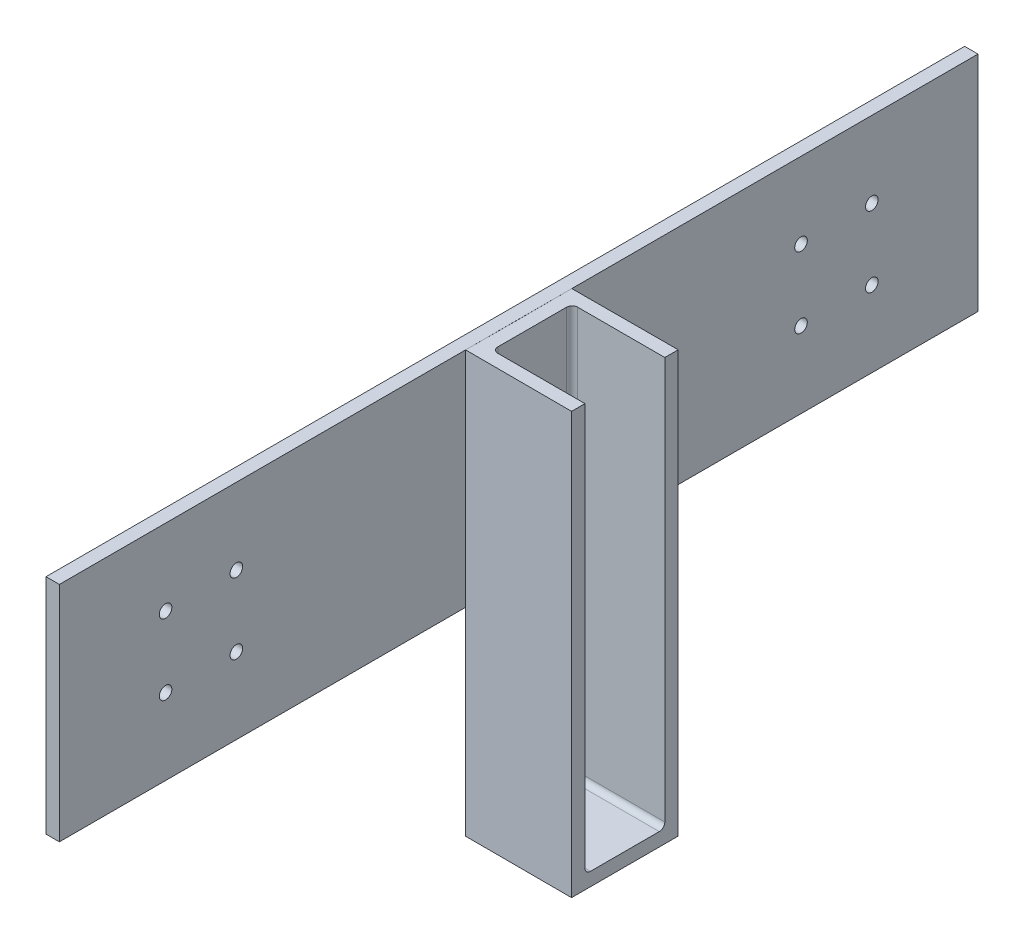
ISO-10303-21;
HEADER;
FILE_DESCRIPTION(('STEP AP214'),'2;1');
FILE_NAME('part.step','',(''),(''),'','','');
FILE_SCHEMA(('AUTOMOTIVE_DESIGN { 1 0 10303 214 1 1 1 1 }'));
ENDSEC;
DATA;
#1=APPLICATION_CONTEXT('core data for automotive mechanical design processes');
#2=APPLICATION_PROTOCOL_DEFINITION('international standard','automotive_design',2000,#1);
#3=PRODUCT_CONTEXT('',#1,'mechanical');
#4=PRODUCT('Part','Part','',(#3));
#5=PRODUCT_RELATED_PRODUCT_CATEGORY('part','',(#4));
#6=PRODUCT_DEFINITION_FORMATION('','',#4);
#7=PRODUCT_DEFINITION_CONTEXT('part definition',#1,'design');
#8=PRODUCT_DEFINITION('design','',#6,#7);
#9=PRODUCT_DEFINITION_SHAPE('','',#8);
#10=(LENGTH_UNIT() NAMED_UNIT(*) SI_UNIT(.MILLI.,.METRE.));
#11=(NAMED_UNIT(*) PLANE_ANGLE_UNIT() SI_UNIT($,.RADIAN.));
#12=(NAMED_UNIT(*) SI_UNIT($,.STERADIAN.) SOLID_ANGLE_UNIT());
#13=UNCERTAINTY_MEASURE_WITH_UNIT(LENGTH_MEASURE(1.E-05),#10,'distance_accuracy_value','');
#14=(GEOMETRIC_REPRESENTATION_CONTEXT(3) GLOBAL_UNCERTAINTY_ASSIGNED_CONTEXT((#13)) GLOBAL_UNIT_ASSIGNED_CONTEXT((#10,
#11,#12)) REPRESENTATION_CONTEXT('',''));
#15=CARTESIAN_POINT('',(0.,0.,0.));
#16=DIRECTION('',(0.,0.,1.));
#17=DIRECTION('',(1.,0.,0.));
#18=AXIS2_PLACEMENT_3D('',#15,#16,#17);
#19=CARTESIAN_POINT('',(21.45,-47.5614084507042,-53.5877812618552));
#20=DIRECTION('',(0.,0.,1.));
#21=DIRECTION('',(1.,0.,0.));
#22=AXIS2_PLACEMENT_3D('',#19,#20,#21);
#23=PLANE('',#22);
#24=DIRECTION('',(0.,1.,0.));
#25=VECTOR('',#24,1.);
#26=CARTESIAN_POINT('',(5.82012302529325,-45.1614084507042,-53.5877812618552));
#27=LINE('',#26,#25);
#28=CARTESIAN_POINT('',(5.82012302529325,27.9985915492958,-53.5877812618552));
#29=VERTEX_POINT('',#28);
#30=CARTESIAN_POINT('',(5.82012302529325,-44.1614084507042,-53.5877812618552));
#31=VERTEX_POINT('',#30);
#32=EDGE_CURVE('E219',#29,#31,#27,.F.);
#33=ORIENTED_EDGE('',*,*,#32,.T.);
#34=DIRECTION('',(1.,0.,0.));
#35=VECTOR('',#34,1.);
#36=CARTESIAN_POINT('',(21.45,-44.1614084507042,-53.5877812618552));
#37=LINE('',#36,#35);
#38=CARTESIAN_POINT('',(21.45,-44.1614084507042,-53.5877812618552));
#39=VERTEX_POINT('',#38);
#40=EDGE_CURVE('E221',#31,#39,#37,.T.);
#41=ORIENTED_EDGE('',*,*,#40,.T.);
#42=DIRECTION('',(0.,1.,0.));
#43=VECTOR('',#42,1.);
#44=CARTESIAN_POINT('',(21.45,-47.5614084507042,-53.5877812618552));
#45=LINE('',#44,#43);
#46=CARTESIAN_POINT('',(21.45,27.9985915492958,-53.5877812618552));
#47=VERTEX_POINT('',#46);
#48=EDGE_CURVE('E203',#39,#47,#45,.T.);
#49=ORIENTED_EDGE('',*,*,#48,.T.);
#50=DIRECTION('',(1.,0.,0.));
#51=VECTOR('',#50,1.);
#52=CARTESIAN_POINT('',(21.45,27.9985915492958,-53.5877812618552));
#53=LINE('',#52,#51);
#54=EDGE_CURVE('E190',#29,#47,#53,.T.);
#55=ORIENTED_EDGE('',*,*,#54,.F.);
#56=EDGE_LOOP('',(#33,#41,#49,#55));
#57=FACE_BOUND('',#56,.T.);
#58=ADVANCED_FACE('F45',(#57),#23,.T.);
#59=CARTESIAN_POINT('',(4.82012302529325,-47.5614084507042,-53.5877812618552));
#60=DIRECTION('',(1.,0.,0.));
#61=DIRECTION('',(0.,0.,-1.));
#62=AXIS2_PLACEMENT_3D('',#59,#60,#61);
#63=PLANE('',#62);
#64=DIRECTION('',(0.,0.,-1.));
#65=VECTOR('',#64,1.);
#66=CARTESIAN_POINT('',(4.82012302529325,-44.1614084507042,-53.5877812618552));
#67=LINE('',#66,#65);
#68=CARTESIAN_POINT('',(4.82012302529325,-44.1614084507042,-40.25728916068));
#69=VERTEX_POINT('',#68);
#70=CARTESIAN_POINT('',(4.82012302529325,-44.1614084507042,-52.5877812618552));
#71=VERTEX_POINT('',#70);
#72=EDGE_CURVE('E62',#69,#71,#67,.T.);
#73=ORIENTED_EDGE('',*,*,#72,.T.);
#74=DIRECTION('',(0.,1.,0.));
#75=VECTOR('',#74,1.);
#76=CARTESIAN_POINT('',(4.82012302529325,27.9985915492958,-52.5877812618552));
#77=LINE('',#76,#75);
#78=CARTESIAN_POINT('',(4.82012302529325,27.9985915492958,-52.5877812618552));
#79=VERTEX_POINT('',#78);
#80=EDGE_CURVE('E225',#71,#79,#77,.T.);
#81=ORIENTED_EDGE('',*,*,#80,.T.);
#82=DIRECTION('',(0.,0.,-1.));
#83=VECTOR('',#82,1.);
#84=CARTESIAN_POINT('',(4.82012302529325,27.9985915492958,-53.5877812618552));
#85=LINE('',#84,#83);
#86=CARTESIAN_POINT('',(4.82012302529325,27.9985915492958,-40.25728916068));
#87=VERTEX_POINT('',#86);
#88=EDGE_CURVE('E187',#87,#79,#85,.T.);
#89=ORIENTED_EDGE('',*,*,#88,.F.);
#90=DIRECTION('',(0.,1.,0.));
#91=VECTOR('',#90,1.);
#92=CARTESIAN_POINT('',(4.82012302529325,-45.1614084507042,-40.25728916068));
#93=LINE('',#92,#91);
#94=EDGE_CURVE('E67',#87,#69,#93,.F.);
#95=ORIENTED_EDGE('',*,*,#94,.T.);
#96=EDGE_LOOP('',(#73,#81,#89,#95));
#97=FACE_BOUND('',#96,.T.);
#98=ADVANCED_FACE('F287',(#97),#63,.T.);
#99=CARTESIAN_POINT('',(21.45,-47.5614084507042,-39.25728916068));
#100=DIRECTION('',(0.,0.,-1.));
#101=DIRECTION('',(-1.,0.,0.));
#102=AXIS2_PLACEMENT_3D('',#99,#100,#101);
#103=PLANE('',#102);
#104=DIRECTION('',(0.,1.,0.));
#105=VECTOR('',#104,1.);
#106=CARTESIAN_POINT('',(21.45,-47.5614084507042,-39.25728916068));
#107=LINE('',#106,#105);
#108=CARTESIAN_POINT('',(21.45,-44.1614084507042,-39.25728916068));
#109=VERTEX_POINT('',#108);
#110=CARTESIAN_POINT('',(21.45,27.9985915492958,-39.25728916068));
#111=VERTEX_POINT('',#110);
#112=EDGE_CURVE('E206',#109,#111,#107,.T.);
#113=ORIENTED_EDGE('',*,*,#112,.F.);
#114=DIRECTION('',(-1.,0.,0.));
#115=VECTOR('',#114,1.);
#116=CARTESIAN_POINT('',(21.45,-44.1614084507042,-39.25728916068));
#117=LINE('',#116,#115);
#118=CARTESIAN_POINT('',(5.82012302529325,-44.1614084507042,-39.25728916068));
#119=VERTEX_POINT('',#118);
#120=EDGE_CURVE('E210',#109,#119,#117,.T.);
#121=ORIENTED_EDGE('',*,*,#120,.T.);
#122=DIRECTION('',(0.,1.,0.));
#123=VECTOR('',#122,1.);
#124=CARTESIAN_POINT('',(5.82012302529325,27.9985915492958,-39.25728916068));
#125=LINE('',#124,#123);
#126=CARTESIAN_POINT('',(5.82012302529325,27.9985915492958,-39.25728916068));
#127=VERTEX_POINT('',#126);
#128=EDGE_CURVE('E198',#119,#127,#125,.T.);
#129=ORIENTED_EDGE('',*,*,#128,.T.);
#130=DIRECTION('',(-1.,0.,0.));
#131=VECTOR('',#130,1.);
#132=CARTESIAN_POINT('',(21.45,27.9985915492958,-39.25728916068));
#133=LINE('',#132,#131);
#134=EDGE_CURVE('E184',#111,#127,#133,.T.);
#135=ORIENTED_EDGE('',*,*,#134,.F.);
#136=EDGE_LOOP('',(#113,#121,#129,#135));
#137=FACE_BOUND('',#136,.T.);
#138=ADVANCED_FACE('F266',(#137),#103,.T.);
#139=CARTESIAN_POINT('',(2.42012302529325,-47.5614084507042,-46.4225352112676));
#140=DIRECTION('',(-0.999997768354908,0.,-0.00211264885940152));
#141=DIRECTION('',(-0.00211264885940152,0.,0.999997768354908));
#142=AXIS2_PLACEMENT_3D('',#139,#140,#141);
#143=PLANE('',#142);
#144=DIRECTION('',(-0.00211264885940152,0.,0.999997768354908));
#145=VECTOR('',#144,1.);
#146=CARTESIAN_POINT('',(2.42012302529325,27.9985915492958,-46.4225352112676));
#147=LINE('',#146,#145);
#148=CARTESIAN_POINT('',(2.42012302529325,27.9985915492958,-46.4225352112676));
#149=VERTEX_POINT('',#148);
#150=CARTESIAN_POINT('',(2.4,27.9985915492958,-36.8975352112676));
#151=VERTEX_POINT('',#150);
#152=EDGE_CURVE('E178',#149,#151,#147,.T.);
#153=ORIENTED_EDGE('',*,*,#152,.F.);
#154=DIRECTION('',(0.,1.,0.));
#155=VECTOR('',#154,1.);
#156=CARTESIAN_POINT('',(2.42012302529325,-47.5614084507042,-46.4225352112676));
#157=LINE('',#156,#155);
#158=CARTESIAN_POINT('',(2.42012302529325,-47.5614084507042,-46.4225352112676));
#159=VERTEX_POINT('',#158);
#160=EDGE_CURVE('E164',#159,#149,#157,.T.);
#161=ORIENTED_EDGE('',*,*,#160,.F.);
#162=DIRECTION('',(-0.00211264885940152,0.,0.999997768354908));
#163=VECTOR('',#162,1.);
#164=CARTESIAN_POINT('',(2.42012302529325,-47.5614084507042,-46.4225352112676));
#165=LINE('',#164,#163);
#166=CARTESIAN_POINT('',(2.4,-47.5614084507042,-36.8975352112676));
#167=VERTEX_POINT('',#166);
#168=EDGE_CURVE('E158',#159,#167,#165,.T.);
#169=ORIENTED_EDGE('',*,*,#168,.T.);
#170=DIRECTION('',(0.,1.,0.));
#171=VECTOR('',#170,1.);
#172=CARTESIAN_POINT('',(2.4,-47.5614084507042,-36.8975352112676));
#173=LINE('',#172,#171);
#174=EDGE_CURVE('E140',#167,#151,#173,.T.);
#175=ORIENTED_EDGE('',*,*,#174,.T.);
#176=EDGE_LOOP('',(#153,#161,#169,#175));
#177=FACE_BOUND('',#176,.T.);
#178=ADVANCED_FACE('F163',(#177),#143,.T.);
#179=CARTESIAN_POINT('',(2.42012302529325,-47.5614084507042,-46.4225352112676));
#180=DIRECTION('',(-0.999997768354908,0.,0.00211264885940152));
#181=DIRECTION('',(0.00211264885940152,0.,0.999997768354908));
#182=AXIS2_PLACEMENT_3D('',#179,#180,#181);
#183=PLANE('',#182);
#184=DIRECTION('',(0.00211264885940152,0.,0.999997768354908));
#185=VECTOR('',#184,1.);
#186=CARTESIAN_POINT('',(2.42012302529325,27.9985915492958,-46.4225352112676));
#187=LINE('',#186,#185);
#188=CARTESIAN_POINT('',(2.4,27.9985915492958,-55.9475352112676));
#189=VERTEX_POINT('',#188);
#190=EDGE_CURVE('E165',#189,#149,#187,.T.);
#191=ORIENTED_EDGE('',*,*,#190,.F.);
#192=DIRECTION('',(0.,1.,0.));
#193=VECTOR('',#192,1.);
#194=CARTESIAN_POINT('',(2.4,-47.5614084507042,-55.9475352112676));
#195=LINE('',#194,#193);
#196=CARTESIAN_POINT('',(2.4,-47.5614084507042,-55.9475352112676));
#197=VERTEX_POINT('',#196);
#198=EDGE_CURVE('E199',#197,#189,#195,.T.);
#199=ORIENTED_EDGE('',*,*,#198,.F.);
#200=DIRECTION('',(0.00211264885940152,0.,0.999997768354908));
#201=VECTOR('',#200,1.);
#202=CARTESIAN_POINT('',(2.42012302529325,-47.5614084507042,-46.4225352112676));
#203=LINE('',#202,#201);
#204=EDGE_CURVE('E151',#197,#159,#203,.T.);
#205=ORIENTED_EDGE('',*,*,#204,.T.);
#206=ORIENTED_EDGE('',*,*,#160,.T.);
#207=EDGE_LOOP('',(#191,#199,#205,#206));
#208=FACE_BOUND('',#207,.T.);
#209=ADVANCED_FACE('F275',(#208),#183,.T.);
#210=CARTESIAN_POINT('',(2.4,-47.5614084507042,-55.9475352112676));
#211=DIRECTION('',(-0.00211264885945948,0.,-0.999997768354908));
#212=DIRECTION('',(-0.999997768354908,0.,0.00211264885945948));
#213=AXIS2_PLACEMENT_3D('',#210,#211,#212);
#214=PLANE('',#213);
#215=DIRECTION('',(-0.999997768354908,0.,0.00211264885945948));
#216=VECTOR('',#215,1.);
#217=CARTESIAN_POINT('',(2.4,27.9985915492958,-55.9475352112676));
#218=LINE('',#217,#216);
#219=CARTESIAN_POINT('',(21.45,27.9985915492958,-55.9877812618552));
#220=VERTEX_POINT('',#219);
#221=EDGE_CURVE('E168',#220,#189,#218,.T.);
#222=ORIENTED_EDGE('',*,*,#221,.F.);
#223=DIRECTION('',(0.,1.,0.));
#224=VECTOR('',#223,1.);
#225=CARTESIAN_POINT('',(21.45,-47.5614084507042,-55.9877812618552));
#226=LINE('',#225,#224);
#227=CARTESIAN_POINT('',(21.45,-47.5614084507042,-55.9877812618552));
#228=VERTEX_POINT('',#227);
#229=EDGE_CURVE('E201',#228,#220,#226,.T.);
#230=ORIENTED_EDGE('',*,*,#229,.F.);
#231=DIRECTION('',(-0.999997768354908,0.,0.00211264885945948));
#232=VECTOR('',#231,1.);
#233=CARTESIAN_POINT('',(2.4,-47.5614084507042,-55.9475352112676));
#234=LINE('',#233,#232);
#235=EDGE_CURVE('E174',#228,#197,#234,.T.);
#236=ORIENTED_EDGE('',*,*,#235,.T.);
#237=ORIENTED_EDGE('',*,*,#198,.T.);
#238=EDGE_LOOP('',(#222,#230,#236,#237));
#239=FACE_BOUND('',#238,.T.);
#240=ADVANCED_FACE('F278',(#239),#214,.T.);
#241=CARTESIAN_POINT('',(21.45,-47.5614084507042,-55.9877812618552));
#242=DIRECTION('',(1.,0.,0.));
#243=DIRECTION('',(0.,0.,-1.));
#244=AXIS2_PLACEMENT_3D('',#241,#242,#243);
#245=PLANE('',#244);
#246=DIRECTION('',(0.,0.,-1.));
#247=VECTOR('',#246,1.);
#248=CARTESIAN_POINT('',(21.45,27.9985915492958,-55.9877812618552));
#249=LINE('',#248,#247);
#250=EDGE_CURVE('E192',#47,#220,#249,.T.);
#251=ORIENTED_EDGE('',*,*,#250,.F.);
#252=ORIENTED_EDGE('',*,*,#48,.F.);
#253=CARTESIAN_POINT('',(21.45,-44.1614084507042,-52.5877812618552));
#254=DIRECTION('',(1.,0.,0.));
#255=DIRECTION('',(0.,0.,-1.));
#256=AXIS2_PLACEMENT_3D('',#253,#254,#255);
#257=CIRCLE('',#256,1.);
#258=CARTESIAN_POINT('',(21.45,-45.1614084507042,-52.5877812618552));
#259=VERTEX_POINT('',#258);
#260=EDGE_CURVE('E229',#39,#259,#257,.F.);
#261=ORIENTED_EDGE('',*,*,#260,.T.);
#262=DIRECTION('',(0.,0.,1.));
#263=VECTOR('',#262,1.);
#264=CARTESIAN_POINT('',(21.45,-45.1614084507042,-39.25728916068));
#265=LINE('',#264,#263);
#266=CARTESIAN_POINT('',(21.45,-45.1614084507042,-40.25728916068));
#267=VERTEX_POINT('',#266);
#268=EDGE_CURVE('E171',#259,#267,#265,.T.);
#269=ORIENTED_EDGE('',*,*,#268,.T.);
#270=CARTESIAN_POINT('',(21.45,-44.1614084507042,-40.25728916068));
#271=DIRECTION('',(1.,0.,0.));
#272=DIRECTION('',(0.,0.,-1.));
#273=AXIS2_PLACEMENT_3D('',#270,#271,#272);
#274=CIRCLE('',#273,1.);
#275=EDGE_CURVE('E227',#267,#109,#274,.F.);
#276=ORIENTED_EDGE('',*,*,#275,.T.);
#277=ORIENTED_EDGE('',*,*,#112,.T.);
#278=DIRECTION('',(0.,0.,-1.));
#279=VECTOR('',#278,1.);
#280=CARTESIAN_POINT('',(21.45,27.9985915492958,-36.85728916068));
#281=LINE('',#280,#279);
#282=CARTESIAN_POINT('',(21.45,27.9985915492958,-36.85728916068));
#283=VERTEX_POINT('',#282);
#284=EDGE_CURVE('E181',#283,#111,#281,.T.);
#285=ORIENTED_EDGE('',*,*,#284,.F.);
#286=DIRECTION('',(0.,1.,0.));
#287=VECTOR('',#286,1.);
#288=CARTESIAN_POINT('',(21.45,-47.5614084507042,-36.85728916068));
#289=LINE('',#288,#287);
#290=CARTESIAN_POINT('',(21.45,-47.5614084507042,-36.85728916068));
#291=VERTEX_POINT('',#290);
#292=EDGE_CURVE('E150',#291,#283,#289,.T.);
#293=ORIENTED_EDGE('',*,*,#292,.F.);
#294=DIRECTION('',(0.,0.,-1.));
#295=VECTOR('',#294,1.);
#296=CARTESIAN_POINT('',(21.45,-47.5614084507042,-36.85728916068));
#297=LINE('',#296,#295);
#298=EDGE_CURVE('E161',#291,#228,#297,.T.);
#299=ORIENTED_EDGE('',*,*,#298,.T.);
#300=ORIENTED_EDGE('',*,*,#229,.T.);
#301=EDGE_LOOP('',(#251,#252,#261,#269,#276,#277,#285,#293,#299,#300));
#302=FACE_BOUND('',#301,.T.);
#303=ADVANCED_FACE('F254',(#302),#245,.T.);
#304=CARTESIAN_POINT('',(2.4,-47.5614084507042,-36.8975352112676));
#305=DIRECTION('',(-0.00211264885945948,0.,0.999997768354908));
#306=DIRECTION('',(0.999997768354908,0.,0.00211264885945948));
#307=AXIS2_PLACEMENT_3D('',#304,#305,#306);
#308=PLANE('',#307);
#309=DIRECTION('',(0.999997768354908,0.,0.00211264885945948));
#310=VECTOR('',#309,1.);
#311=CARTESIAN_POINT('',(2.4,27.9985915492958,-36.8975352112676));
#312=LINE('',#311,#310);
#313=EDGE_CURVE('E145',#151,#283,#312,.T.);
#314=ORIENTED_EDGE('',*,*,#313,.F.);
#315=ORIENTED_EDGE('',*,*,#174,.F.);
#316=DIRECTION('',(0.999997768354908,0.,0.00211264885945948));
#317=VECTOR('',#316,1.);
#318=CARTESIAN_POINT('',(2.4,-47.5614084507042,-36.8975352112676));
#319=LINE('',#318,#317);
#320=EDGE_CURVE('E143',#167,#291,#319,.T.);
#321=ORIENTED_EDGE('',*,*,#320,.T.);
#322=ORIENTED_EDGE('',*,*,#292,.T.);
#323=EDGE_LOOP('',(#314,#315,#321,#322));
#324=FACE_BOUND('',#323,.T.);
#325=ADVANCED_FACE('F142',(#324),#308,.T.);
#326=CARTESIAN_POINT('',(0.,-47.5614084507042,0.));
#327=DIRECTION('',(0.,1.,0.));
#328=DIRECTION('',(0.,0.,1.));
#329=AXIS2_PLACEMENT_3D('',#326,#327,#328);
#330=PLANE('',#329);
#331=ORIENTED_EDGE('',*,*,#168,.F.);
#332=ORIENTED_EDGE('',*,*,#204,.F.);
#333=ORIENTED_EDGE('',*,*,#235,.F.);
#334=ORIENTED_EDGE('',*,*,#298,.F.);
#335=ORIENTED_EDGE('',*,*,#320,.F.);
#336=EDGE_LOOP('',(#331,#332,#333,#334,#335));
#337=FACE_BOUND('',#336,.T.);
#338=ADVANCED_FACE('F156',(#337),#330,.F.);
#339=CARTESIAN_POINT('',(0.,27.9985915492958,0.));
#340=DIRECTION('',(0.,1.,0.));
#341=DIRECTION('',(0.,0.,1.));
#342=AXIS2_PLACEMENT_3D('',#339,#340,#341);
#343=PLANE('',#342);
#344=ORIENTED_EDGE('',*,*,#152,.T.);
#345=ORIENTED_EDGE('',*,*,#313,.T.);
#346=ORIENTED_EDGE('',*,*,#284,.T.);
#347=ORIENTED_EDGE('',*,*,#134,.T.);
#348=CARTESIAN_POINT('',(5.82012302529325,27.9985915492958,-40.25728916068));
#349=DIRECTION('',(0.,1.,0.));
#350=DIRECTION('',(0.,0.,1.));
#351=AXIS2_PLACEMENT_3D('',#348,#349,#350);
#352=CIRCLE('',#351,1.);
#353=EDGE_CURVE('E12',#127,#87,#352,.F.);
#354=ORIENTED_EDGE('',*,*,#353,.T.);
#355=ORIENTED_EDGE('',*,*,#88,.T.);
#356=CARTESIAN_POINT('',(5.82012302529325,27.9985915492958,-52.5877812618552));
#357=DIRECTION('',(0.,1.,0.));
#358=DIRECTION('',(0.,0.,1.));
#359=AXIS2_PLACEMENT_3D('',#356,#357,#358);
#360=CIRCLE('',#359,1.);
#361=EDGE_CURVE('E54',#79,#29,#360,.F.);
#362=ORIENTED_EDGE('',*,*,#361,.T.);
#363=ORIENTED_EDGE('',*,*,#54,.T.);
#364=ORIENTED_EDGE('',*,*,#250,.T.);
#365=ORIENTED_EDGE('',*,*,#221,.T.);
#366=ORIENTED_EDGE('',*,*,#190,.T.);
#367=EDGE_LOOP('',(#344,#345,#346,#347,#354,#355,#362,#363,#364,#365,#366));
#368=FACE_BOUND('',#367,.T.);
#369=ADVANCED_FACE('F271',(#368),#343,.T.);
#370=CARTESIAN_POINT('',(0.,-45.1614084507042,0.));
#371=DIRECTION('',(0.,-1.,0.));
#372=DIRECTION('',(0.,0.,-1.));
#373=AXIS2_PLACEMENT_3D('',#370,#371,#372);
#374=PLANE('',#373);
#375=DIRECTION('',(0.,0.,-1.));
#376=VECTOR('',#375,1.);
#377=CARTESIAN_POINT('',(5.82012302529325,-45.1614084507042,0.));
#378=LINE('',#377,#376);
#379=CARTESIAN_POINT('',(5.82012302529325,-45.1614084507042,-52.5877812618552));
#380=VERTEX_POINT('',#379);
#381=CARTESIAN_POINT('',(5.82012302529325,-45.1614084507042,-40.25728916068));
#382=VERTEX_POINT('',#381);
#383=EDGE_CURVE('E213',#380,#382,#378,.F.);
#384=ORIENTED_EDGE('',*,*,#383,.T.);
#385=DIRECTION('',(-1.,0.,0.));
#386=VECTOR('',#385,1.);
#387=CARTESIAN_POINT('',(0.,-45.1614084507042,-40.25728916068));
#388=LINE('',#387,#386);
#389=EDGE_CURVE('E217',#382,#267,#388,.F.);
#390=ORIENTED_EDGE('',*,*,#389,.T.);
#391=ORIENTED_EDGE('',*,*,#268,.F.);
#392=DIRECTION('',(1.,0.,0.));
#393=VECTOR('',#392,1.);
#394=CARTESIAN_POINT('',(0.,-45.1614084507042,-52.5877812618552));
#395=LINE('',#394,#393);
#396=EDGE_CURVE('E215',#259,#380,#395,.F.);
#397=ORIENTED_EDGE('',*,*,#396,.T.);
#398=EDGE_LOOP('',(#384,#390,#391,#397));
#399=FACE_BOUND('',#398,.T.);
#400=ADVANCED_FACE('F365',(#399),#374,.F.);
#401=CARTESIAN_POINT('',(5.82012302529325,-47.5614084507042,-52.5877812618552));
#402=DIRECTION('',(0.,-1.,0.));
#403=DIRECTION('',(0.,0.,-1.));
#404=AXIS2_PLACEMENT_3D('',#401,#402,#403);
#405=CYLINDRICAL_SURFACE('',#404,1.);
#406=ORIENTED_EDGE('',*,*,#361,.F.);
#407=ORIENTED_EDGE('',*,*,#80,.F.);
#408=CARTESIAN_POINT('',(5.82012302529325,-44.1614084507042,-52.5877812618552));
#409=DIRECTION('',(0.,1.,0.));
#410=DIRECTION('',(0.,0.,1.));
#411=AXIS2_PLACEMENT_3D('',#408,#409,#410);
#412=CIRCLE('',#411,1.);
#413=EDGE_CURVE('E49',#31,#71,#412,.T.);
#414=ORIENTED_EDGE('',*,*,#413,.F.);
#415=ORIENTED_EDGE('',*,*,#32,.F.);
#416=EDGE_LOOP('',(#406,#407,#414,#415));
#417=FACE_BOUND('',#416,.T.);
#418=ADVANCED_FACE('F47',(#417),#405,.F.);
#419=CARTESIAN_POINT('',(21.45,-44.1614084507042,-52.5877812618552));
#420=DIRECTION('',(1.,0.,0.));
#421=DIRECTION('',(0.,0.,-1.));
#422=AXIS2_PLACEMENT_3D('',#419,#420,#421);
#423=CYLINDRICAL_SURFACE('',#422,1.);
#424=ORIENTED_EDGE('',*,*,#260,.F.);
#425=ORIENTED_EDGE('',*,*,#40,.F.);
#426=CARTESIAN_POINT('',(5.82012302529325,-44.1614084507042,-52.5877812618552));
#427=DIRECTION('',(1.,0.,0.));
#428=DIRECTION('',(0.,0.,-1.));
#429=AXIS2_PLACEMENT_3D('',#426,#427,#428);
#430=CIRCLE('',#429,1.);
#431=EDGE_CURVE('E242',#380,#31,#430,.T.);
#432=ORIENTED_EDGE('',*,*,#431,.F.);
#433=ORIENTED_EDGE('',*,*,#396,.F.);
#434=EDGE_LOOP('',(#424,#425,#432,#433));
#435=FACE_BOUND('',#434,.T.);
#436=ADVANCED_FACE('F285',(#435),#423,.F.);
#437=CARTESIAN_POINT('',(5.82012302529325,-44.1614084507042,-52.5877812618552));
#438=DIRECTION('',(0.,0.,1.));
#439=DIRECTION('',(1.,0.,0.));
#440=AXIS2_PLACEMENT_3D('',#437,#438,#439);
#441=SPHERICAL_SURFACE('',#440,1.);
#442=ORIENTED_EDGE('',*,*,#431,.T.);
#443=ORIENTED_EDGE('',*,*,#413,.T.);
#444=CARTESIAN_POINT('',(5.82012302529325,-44.1614084507042,-52.5877812618552));
#445=DIRECTION('',(0.,0.,1.));
#446=DIRECTION('',(1.,0.,0.));
#447=AXIS2_PLACEMENT_3D('',#444,#445,#446);
#448=CIRCLE('',#447,1.);
#449=EDGE_CURVE('E240',#380,#71,#448,.F.);
#450=ORIENTED_EDGE('',*,*,#449,.F.);
#451=EDGE_LOOP('',(#442,#443,#450));
#452=FACE_BOUND('',#451,.T.);
#453=ADVANCED_FACE('F298',(#452),#441,.F.);
#454=CARTESIAN_POINT('',(5.82012302529325,-47.5614084507042,-40.25728916068));
#455=DIRECTION('',(0.,-1.,0.));
#456=DIRECTION('',(0.,0.,-1.));
#457=AXIS2_PLACEMENT_3D('',#454,#455,#456);
#458=CYLINDRICAL_SURFACE('',#457,1.);
#459=ORIENTED_EDGE('',*,*,#353,.F.);
#460=ORIENTED_EDGE('',*,*,#128,.F.);
#461=CARTESIAN_POINT('',(5.82012302529325,-44.1614084507042,-40.25728916068));
#462=DIRECTION('',(0.,1.,0.));
#463=DIRECTION('',(0.,0.,1.));
#464=AXIS2_PLACEMENT_3D('',#461,#462,#463);
#465=CIRCLE('',#464,1.);
#466=EDGE_CURVE('E237',#69,#119,#465,.T.);
#467=ORIENTED_EDGE('',*,*,#466,.F.);
#468=ORIENTED_EDGE('',*,*,#94,.F.);
#469=EDGE_LOOP('',(#459,#460,#467,#468));
#470=FACE_BOUND('',#469,.T.);
#471=ADVANCED_FACE('F290',(#470),#458,.F.);
#472=CARTESIAN_POINT('',(5.82012302529325,-44.1614084507042,-53.5877812618552));
#473=DIRECTION('',(0.,0.,-1.));
#474=DIRECTION('',(-1.,0.,0.));
#475=AXIS2_PLACEMENT_3D('',#472,#473,#474);
#476=CYLINDRICAL_SURFACE('',#475,1.);
#477=ORIENTED_EDGE('',*,*,#449,.T.);
#478=ORIENTED_EDGE('',*,*,#72,.F.);
#479=CARTESIAN_POINT('',(5.82012302529325,-44.1614084507042,-40.25728916068));
#480=DIRECTION('',(0.,0.,-1.));
#481=DIRECTION('',(-1.,0.,0.));
#482=AXIS2_PLACEMENT_3D('',#479,#480,#481);
#483=CIRCLE('',#482,1.);
#484=EDGE_CURVE('E234',#382,#69,#483,.T.);
#485=ORIENTED_EDGE('',*,*,#484,.F.);
#486=ORIENTED_EDGE('',*,*,#383,.F.);
#487=EDGE_LOOP('',(#477,#478,#485,#486));
#488=FACE_BOUND('',#487,.T.);
#489=ADVANCED_FACE('F297',(#488),#476,.F.);
#490=CARTESIAN_POINT('',(5.82012302529325,-44.1614084507042,-40.25728916068));
#491=DIRECTION('',(0.,0.,1.));
#492=DIRECTION('',(1.,0.,0.));
#493=AXIS2_PLACEMENT_3D('',#490,#491,#492);
#494=SPHERICAL_SURFACE('',#493,1.);
#495=ORIENTED_EDGE('',*,*,#484,.T.);
#496=ORIENTED_EDGE('',*,*,#466,.T.);
#497=CARTESIAN_POINT('',(5.82012302529325,-44.1614084507042,-40.25728916068));
#498=DIRECTION('',(1.,0.,0.));
#499=DIRECTION('',(0.,1.,0.));
#500=AXIS2_PLACEMENT_3D('',#497,#498,#499);
#501=CIRCLE('',#500,1.);
#502=EDGE_CURVE('E232',#382,#119,#501,.F.);
#503=ORIENTED_EDGE('',*,*,#502,.F.);
#504=EDGE_LOOP('',(#495,#496,#503));
#505=FACE_BOUND('',#504,.T.);
#506=ADVANCED_FACE('F294',(#505),#494,.F.);
#507=CARTESIAN_POINT('',(21.45,-44.1614084507042,-40.25728916068));
#508=DIRECTION('',(-1.,0.,0.));
#509=DIRECTION('',(0.,0.,1.));
#510=AXIS2_PLACEMENT_3D('',#507,#508,#509);
#511=CYLINDRICAL_SURFACE('',#510,1.);
#512=ORIENTED_EDGE('',*,*,#275,.F.);
#513=ORIENTED_EDGE('',*,*,#389,.F.);
#514=ORIENTED_EDGE('',*,*,#502,.T.);
#515=ORIENTED_EDGE('',*,*,#120,.F.);
#516=EDGE_LOOP('',(#512,#513,#514,#515));
#517=FACE_BOUND('',#516,.T.);
#518=ADVANCED_FACE('F263',(#517),#511,.F.);
#519=CLOSED_SHELL('',(#58,#98,#138,#178,#209,#240,#303,#325,#338,#369,#400,#418,#436,#453,#471,
#489,#506,#518));
#520=MANIFOLD_SOLID_BREP('B2',#519);
#521=CARTESIAN_POINT('',(2.4,0.,0.));
#522=DIRECTION('',(1.,0.,0.));
#523=DIRECTION('',(0.,0.,-1.));
#524=AXIS2_PLACEMENT_3D('',#521,#522,#523);
#525=PLANE('',#524);
#526=DIRECTION('',(0.,0.,-1.));
#527=VECTOR('',#526,1.);
#528=CARTESIAN_POINT('',(2.4,-12.0014084507042,35.9774647887324));
#529=LINE('',#528,#527);
#530=CARTESIAN_POINT('',(2.4,-12.0014084507042,35.9774647887324));
#531=VERTEX_POINT('',#530);
#532=CARTESIAN_POINT('',(2.4,-12.0014084507042,-128.822535211268));
#533=VERTEX_POINT('',#532);
#534=EDGE_CURVE('E501',#531,#533,#529,.T.);
#535=ORIENTED_EDGE('',*,*,#534,.T.);
#536=DIRECTION('',(0.,1.,0.));
#537=VECTOR('',#536,1.);
#538=CARTESIAN_POINT('',(2.4,27.9985915492958,-128.822535211268));
#539=LINE('',#538,#537);
#540=CARTESIAN_POINT('',(2.4,27.9985915492958,-128.822535211268));
#541=VERTEX_POINT('',#540);
#542=EDGE_CURVE('E504',#533,#541,#539,.T.);
#543=ORIENTED_EDGE('',*,*,#542,.T.);
#544=DIRECTION('',(0.,0.,1.));
#545=VECTOR('',#544,1.);
#546=CARTESIAN_POINT('',(2.4,27.9985915492958,35.9774647887324));
#547=LINE('',#546,#545);
#548=CARTESIAN_POINT('',(2.4,27.9985915492958,35.9774647887324));
#549=VERTEX_POINT('',#548);
#550=EDGE_CURVE('E471',#541,#549,#547,.T.);
#551=ORIENTED_EDGE('',*,*,#550,.T.);
#552=DIRECTION('',(0.,-1.,0.));
#553=VECTOR('',#552,1.);
#554=CARTESIAN_POINT('',(2.4,27.9985915492958,35.9774647887324));
#555=LINE('',#554,#553);
#556=EDGE_CURVE('E506',#549,#531,#555,.T.);
#557=ORIENTED_EDGE('',*,*,#556,.T.);
#558=EDGE_LOOP('',(#535,#543,#551,#557));
#559=FACE_BOUND('',#558,.T.);
#560=CARTESIAN_POINT('',(2.4,1.64859154929579,4.22746478873238));
#561=DIRECTION('',(1.,0.,0.));
#562=DIRECTION('',(0.,0.,-1.));
#563=AXIS2_PLACEMENT_3D('',#560,#561,#562);
#564=CIRCLE('',#563,1.13);
#565=CARTESIAN_POINT('',(2.4,1.64859154929579,3.09746478873238));
#566=VERTEX_POINT('',#565);
#567=EDGE_CURVE('E542',#566,#566,#564,.T.);
#568=ORIENTED_EDGE('',*,*,#567,.F.);
#569=EDGE_LOOP('',(#568));
#570=FACE_BOUND('',#569,.T.);
#571=CARTESIAN_POINT('',(2.4,14.3485915492958,16.9274647887324));
#572=DIRECTION('',(1.,0.,0.));
#573=DIRECTION('',(0.,0.,-1.));
#574=AXIS2_PLACEMENT_3D('',#571,#572,#573);
#575=CIRCLE('',#574,1.13);
#576=CARTESIAN_POINT('',(2.4,14.3485915492958,15.7974647887324));
#577=VERTEX_POINT('',#576);
#578=EDGE_CURVE('E521',#577,#577,#575,.T.);
#579=ORIENTED_EDGE('',*,*,#578,.F.);
#580=EDGE_LOOP('',(#579));
#581=FACE_BOUND('',#580,.T.);
#582=CARTESIAN_POINT('',(2.4,14.3485915492958,4.22746478873235));
#583=DIRECTION('',(1.,0.,0.));
#584=DIRECTION('',(0.,0.,1.));
#585=AXIS2_PLACEMENT_3D('',#582,#583,#584);
#586=CIRCLE('',#585,1.13);
#587=CARTESIAN_POINT('',(2.4,14.3485915492958,5.35746478873235));
#588=VERTEX_POINT('',#587);
#589=EDGE_CURVE('E536',#588,#588,#586,.T.);
#590=ORIENTED_EDGE('',*,*,#589,.F.);
#591=EDGE_LOOP('',(#590));
#592=FACE_BOUND('',#591,.T.);
#593=CARTESIAN_POINT('',(2.4,1.64859154929579,16.9274647887324));
#594=DIRECTION('',(1.,0.,0.));
#595=DIRECTION('',(0.,0.,1.));
#596=AXIS2_PLACEMENT_3D('',#593,#594,#595);
#597=CIRCLE('',#596,1.13);
#598=CARTESIAN_POINT('',(2.4,1.64859154929579,18.0574647887324));
#599=VERTEX_POINT('',#598);
#600=EDGE_CURVE('E548',#599,#599,#597,.T.);
#601=ORIENTED_EDGE('',*,*,#600,.F.);
#602=EDGE_LOOP('',(#601));
#603=FACE_BOUND('',#602,.T.);
#604=CARTESIAN_POINT('',(2.4,14.3485915492957,-109.772535211268));
#605=DIRECTION('',(1.,0.,0.));
#606=DIRECTION('',(0.,0.,1.));
#607=AXIS2_PLACEMENT_3D('',#604,#605,#606);
#608=CIRCLE('',#607,1.13000000000001);
#609=CARTESIAN_POINT('',(2.4,14.3485915492957,-108.642535211268));
#610=VERTEX_POINT('',#609);
#611=EDGE_CURVE('E572',#610,#610,#608,.T.);
#612=ORIENTED_EDGE('',*,*,#611,.F.);
#613=EDGE_LOOP('',(#612));
#614=FACE_BOUND('',#613,.T.);
#615=CARTESIAN_POINT('',(2.4,1.64859154929576,-97.0725352112676));
#616=DIRECTION('',(1.,0.,0.));
#617=DIRECTION('',(0.,0.,1.));
#618=AXIS2_PLACEMENT_3D('',#615,#616,#617);
#619=CIRCLE('',#618,1.13000000000001);
#620=CARTESIAN_POINT('',(2.4,1.64859154929576,-95.9425352112676));
#621=VERTEX_POINT('',#620);
#622=EDGE_CURVE('E560',#621,#621,#619,.T.);
#623=ORIENTED_EDGE('',*,*,#622,.F.);
#624=EDGE_LOOP('',(#623));
#625=FACE_BOUND('',#624,.T.);
#626=CARTESIAN_POINT('',(2.4,1.64859154929575,-109.772535211268));
#627=DIRECTION('',(1.,0.,0.));
#628=DIRECTION('',(0.,0.,-1.));
#629=AXIS2_PLACEMENT_3D('',#626,#627,#628);
#630=CIRCLE('',#629,1.13000000000001);
#631=CARTESIAN_POINT('',(2.4,1.64859154929575,-110.902535211268));
#632=VERTEX_POINT('',#631);
#633=EDGE_CURVE('E554',#632,#632,#630,.T.);
#634=ORIENTED_EDGE('',*,*,#633,.F.);
#635=EDGE_LOOP('',(#634));
#636=FACE_BOUND('',#635,.T.);
#637=CARTESIAN_POINT('',(2.4,14.3485915492958,-97.0725352112676));
#638=DIRECTION('',(1.,0.,0.));
#639=DIRECTION('',(0.,0.,-1.));
#640=AXIS2_PLACEMENT_3D('',#637,#638,#639);
#641=CIRCLE('',#640,1.13000000000001);
#642=CARTESIAN_POINT('',(2.4,14.3485915492958,-98.2025352112676));
#643=VERTEX_POINT('',#642);
#644=EDGE_CURVE('E566',#643,#643,#641,.T.);
#645=ORIENTED_EDGE('',*,*,#644,.F.);
#646=EDGE_LOOP('',(#645));
#647=FACE_BOUND('',#646,.T.);
#648=ADVANCED_FACE('F454',(#559,#570,#581,#592,#603,#614,#625,#636,#647),#525,.T.);
#649=CARTESIAN_POINT('',(0.,0.,0.));
#650=DIRECTION('',(1.,0.,0.));
#651=DIRECTION('',(0.,0.,-1.));
#652=AXIS2_PLACEMENT_3D('',#649,#650,#651);
#653=PLANE('',#652);
#654=DIRECTION('',(0.,-1.,0.));
#655=VECTOR('',#654,1.);
#656=CARTESIAN_POINT('',(0.,27.9985915492958,35.9774647887324));
#657=LINE('',#656,#655);
#658=CARTESIAN_POINT('',(0.,27.9985915492958,35.9774647887324));
#659=VERTEX_POINT('',#658);
#660=CARTESIAN_POINT('',(0.,-12.0014084507042,35.9774647887324));
#661=VERTEX_POINT('',#660);
#662=EDGE_CURVE('E518',#659,#661,#657,.T.);
#663=ORIENTED_EDGE('',*,*,#662,.F.);
#664=DIRECTION('',(0.,0.,1.));
#665=VECTOR('',#664,1.);
#666=CARTESIAN_POINT('',(0.,27.9985915492958,35.9774647887324));
#667=LINE('',#666,#665);
#668=CARTESIAN_POINT('',(0.,27.9985915492958,-128.822535211268));
#669=VERTEX_POINT('',#668);
#670=EDGE_CURVE('E494',#669,#659,#667,.T.);
#671=ORIENTED_EDGE('',*,*,#670,.F.);
#672=DIRECTION('',(0.,1.,0.));
#673=VECTOR('',#672,1.);
#674=CARTESIAN_POINT('',(0.,27.9985915492958,-128.822535211268));
#675=LINE('',#674,#673);
#676=CARTESIAN_POINT('',(0.,-12.0014084507042,-128.822535211268));
#677=VERTEX_POINT('',#676);
#678=EDGE_CURVE('E488',#677,#669,#675,.T.);
#679=ORIENTED_EDGE('',*,*,#678,.F.);
#680=DIRECTION('',(0.,0.,-1.));
#681=VECTOR('',#680,1.);
#682=CARTESIAN_POINT('',(0.,-12.0014084507042,35.9774647887324));
#683=LINE('',#682,#681);
#684=EDGE_CURVE('E510',#661,#677,#683,.T.);
#685=ORIENTED_EDGE('',*,*,#684,.F.);
#686=EDGE_LOOP('',(#663,#671,#679,#685));
#687=FACE_BOUND('',#686,.T.);
#688=CARTESIAN_POINT('',(0.,14.3485915492958,16.9274647887324));
#689=DIRECTION('',(1.,0.,0.));
#690=DIRECTION('',(0.,0.,-1.));
#691=AXIS2_PLACEMENT_3D('',#688,#689,#690);
#692=CIRCLE('',#691,1.13);
#693=CARTESIAN_POINT('',(0.,14.3485915492958,15.7974647887324));
#694=VERTEX_POINT('',#693);
#695=EDGE_CURVE('E533',#694,#694,#692,.T.);
#696=ORIENTED_EDGE('',*,*,#695,.T.);
#697=EDGE_LOOP('',(#696));
#698=FACE_BOUND('',#697,.T.);
#699=CARTESIAN_POINT('',(0.,14.3485915492958,4.22746478873235));
#700=DIRECTION('',(1.,0.,0.));
#701=DIRECTION('',(0.,0.,1.));
#702=AXIS2_PLACEMENT_3D('',#699,#700,#701);
#703=CIRCLE('',#702,1.13);
#704=CARTESIAN_POINT('',(0.,14.3485915492958,5.35746478873235));
#705=VERTEX_POINT('',#704);
#706=EDGE_CURVE('E539',#705,#705,#703,.T.);
#707=ORIENTED_EDGE('',*,*,#706,.T.);
#708=EDGE_LOOP('',(#707));
#709=FACE_BOUND('',#708,.T.);
#710=CARTESIAN_POINT('',(0.,1.64859154929579,4.22746478873238));
#711=DIRECTION('',(1.,0.,0.));
#712=DIRECTION('',(0.,0.,-1.));
#713=AXIS2_PLACEMENT_3D('',#710,#711,#712);
#714=CIRCLE('',#713,1.13);
#715=CARTESIAN_POINT('',(0.,1.64859154929579,3.09746478873238));
#716=VERTEX_POINT('',#715);
#717=EDGE_CURVE('E545',#716,#716,#714,.T.);
#718=ORIENTED_EDGE('',*,*,#717,.T.);
#719=EDGE_LOOP('',(#718));
#720=FACE_BOUND('',#719,.T.);
#721=CARTESIAN_POINT('',(0.,1.64859154929579,16.9274647887324));
#722=DIRECTION('',(1.,0.,0.));
#723=DIRECTION('',(0.,0.,1.));
#724=AXIS2_PLACEMENT_3D('',#721,#722,#723);
#725=CIRCLE('',#724,1.13);
#726=CARTESIAN_POINT('',(0.,1.64859154929579,18.0574647887324));
#727=VERTEX_POINT('',#726);
#728=EDGE_CURVE('E551',#727,#727,#725,.T.);
#729=ORIENTED_EDGE('',*,*,#728,.T.);
#730=EDGE_LOOP('',(#729));
#731=FACE_BOUND('',#730,.T.);
#732=CARTESIAN_POINT('',(0.,1.64859154929575,-109.772535211268));
#733=DIRECTION('',(1.,0.,0.));
#734=DIRECTION('',(0.,0.,-1.));
#735=AXIS2_PLACEMENT_3D('',#732,#733,#734);
#736=CIRCLE('',#735,1.13000000000001);
#737=CARTESIAN_POINT('',(0.,1.64859154929575,-110.902535211268));
#738=VERTEX_POINT('',#737);
#739=EDGE_CURVE('E557',#738,#738,#736,.T.);
#740=ORIENTED_EDGE('',*,*,#739,.T.);
#741=EDGE_LOOP('',(#740));
#742=FACE_BOUND('',#741,.T.);
#743=CARTESIAN_POINT('',(0.,1.64859154929576,-97.0725352112676));
#744=DIRECTION('',(1.,0.,0.));
#745=DIRECTION('',(0.,0.,1.));
#746=AXIS2_PLACEMENT_3D('',#743,#744,#745);
#747=CIRCLE('',#746,1.13000000000001);
#748=CARTESIAN_POINT('',(0.,1.64859154929576,-95.9425352112676));
#749=VERTEX_POINT('',#748);
#750=EDGE_CURVE('E563',#749,#749,#747,.T.);
#751=ORIENTED_EDGE('',*,*,#750,.T.);
#752=EDGE_LOOP('',(#751));
#753=FACE_BOUND('',#752,.T.);
#754=CARTESIAN_POINT('',(0.,14.3485915492958,-97.0725352112676));
#755=DIRECTION('',(1.,0.,0.));
#756=DIRECTION('',(0.,0.,-1.));
#757=AXIS2_PLACEMENT_3D('',#754,#755,#756);
#758=CIRCLE('',#757,1.13000000000001);
#759=CARTESIAN_POINT('',(0.,14.3485915492958,-98.2025352112676));
#760=VERTEX_POINT('',#759);
#761=EDGE_CURVE('E569',#760,#760,#758,.T.);
#762=ORIENTED_EDGE('',*,*,#761,.T.);
#763=EDGE_LOOP('',(#762));
#764=FACE_BOUND('',#763,.T.);
#765=CARTESIAN_POINT('',(0.,14.3485915492957,-109.772535211268));
#766=DIRECTION('',(1.,0.,0.));
#767=DIRECTION('',(0.,0.,1.));
#768=AXIS2_PLACEMENT_3D('',#765,#766,#767);
#769=CIRCLE('',#768,1.13000000000001);
#770=CARTESIAN_POINT('',(0.,14.3485915492957,-108.642535211268));
#771=VERTEX_POINT('',#770);
#772=EDGE_CURVE('E575',#771,#771,#769,.T.);
#773=ORIENTED_EDGE('',*,*,#772,.T.);
#774=EDGE_LOOP('',(#773));
#775=FACE_BOUND('',#774,.T.);
#776=ADVANCED_FACE('F529',(#687,#698,#709,#720,#731,#742,#753,#764,#775),#653,.F.);
#777=CARTESIAN_POINT('',(2.4,27.9985915492958,35.9774647887324));
#778=DIRECTION('',(0.,0.,-1.));
#779=DIRECTION('',(0.,1.,0.));
#780=AXIS2_PLACEMENT_3D('',#777,#778,#779);
#781=PLANE('',#780);
#782=ORIENTED_EDGE('',*,*,#662,.T.);
#783=DIRECTION('',(-1.,0.,0.));
#784=VECTOR('',#783,1.);
#785=CARTESIAN_POINT('',(2.4,-12.0014084507042,35.9774647887324));
#786=LINE('',#785,#784);
#787=EDGE_CURVE('E43',#531,#661,#786,.T.);
#788=ORIENTED_EDGE('',*,*,#787,.F.);
#789=ORIENTED_EDGE('',*,*,#556,.F.);
#790=DIRECTION('',(-1.,0.,0.));
#791=VECTOR('',#790,1.);
#792=CARTESIAN_POINT('',(2.4,27.9985915492958,35.9774647887324));
#793=LINE('',#792,#791);
#794=EDGE_CURVE('E514',#549,#659,#793,.T.);
#795=ORIENTED_EDGE('',*,*,#794,.T.);
#796=EDGE_LOOP('',(#782,#788,#789,#795));
#797=FACE_BOUND('',#796,.T.);
#798=ADVANCED_FACE('F456',(#797),#781,.F.);
#799=CARTESIAN_POINT('',(2.4,-12.0014084507042,35.9774647887324));
#800=DIRECTION('',(0.,1.,0.));
#801=DIRECTION('',(0.,0.,1.));
#802=AXIS2_PLACEMENT_3D('',#799,#800,#801);
#803=PLANE('',#802);
#804=ORIENTED_EDGE('',*,*,#684,.T.);
#805=DIRECTION('',(-1.,0.,0.));
#806=VECTOR('',#805,1.);
#807=CARTESIAN_POINT('',(2.4,-12.0014084507042,-128.822535211268));
#808=LINE('',#807,#806);
#809=EDGE_CURVE('E463',#533,#677,#808,.T.);
#810=ORIENTED_EDGE('',*,*,#809,.F.);
#811=ORIENTED_EDGE('',*,*,#534,.F.);
#812=ORIENTED_EDGE('',*,*,#787,.T.);
#813=EDGE_LOOP('',(#804,#810,#811,#812));
#814=FACE_BOUND('',#813,.T.);
#815=ADVANCED_FACE('F509',(#814),#803,.F.);
#816=CARTESIAN_POINT('',(2.4,27.9985915492958,-128.822535211268));
#817=DIRECTION('',(0.,0.,1.));
#818=DIRECTION('',(1.,0.,0.));
#819=AXIS2_PLACEMENT_3D('',#816,#817,#818);
#820=PLANE('',#819);
#821=ORIENTED_EDGE('',*,*,#678,.T.);
#822=DIRECTION('',(-1.,0.,0.));
#823=VECTOR('',#822,1.);
#824=CARTESIAN_POINT('',(2.4,27.9985915492958,-128.822535211268));
#825=LINE('',#824,#823);
#826=EDGE_CURVE('E511',#541,#669,#825,.T.);
#827=ORIENTED_EDGE('',*,*,#826,.F.);
#828=ORIENTED_EDGE('',*,*,#542,.F.);
#829=ORIENTED_EDGE('',*,*,#809,.T.);
#830=EDGE_LOOP('',(#821,#827,#828,#829));
#831=FACE_BOUND('',#830,.T.);
#832=ADVANCED_FACE('F512',(#831),#820,.F.);
#833=CARTESIAN_POINT('',(2.4,27.9985915492958,35.9774647887324));
#834=DIRECTION('',(0.,-1.,0.));
#835=DIRECTION('',(0.,0.,-1.));
#836=AXIS2_PLACEMENT_3D('',#833,#834,#835);
#837=PLANE('',#836);
#838=ORIENTED_EDGE('',*,*,#670,.T.);
#839=ORIENTED_EDGE('',*,*,#794,.F.);
#840=ORIENTED_EDGE('',*,*,#550,.F.);
#841=ORIENTED_EDGE('',*,*,#826,.T.);
#842=EDGE_LOOP('',(#838,#839,#840,#841));
#843=FACE_BOUND('',#842,.T.);
#844=ADVANCED_FACE('F526',(#843),#837,.F.);
#845=CARTESIAN_POINT('',(2.4,14.3485915492958,16.9274647887324));
#846=DIRECTION('',(-1.,0.,0.));
#847=DIRECTION('',(0.,0.,1.));
#848=AXIS2_PLACEMENT_3D('',#845,#846,#847);
#849=CYLINDRICAL_SURFACE('',#848,1.13);
#850=ORIENTED_EDGE('',*,*,#578,.T.);
#851=EDGE_LOOP('',(#850));
#852=FACE_BOUND('',#851,.T.);
#853=ORIENTED_EDGE('',*,*,#695,.F.);
#854=EDGE_LOOP('',(#853));
#855=FACE_BOUND('',#854,.T.);
#856=ADVANCED_FACE('F627',(#852,#855),#849,.F.);
#857=CARTESIAN_POINT('',(2.4,14.3485915492958,4.22746478873235));
#858=DIRECTION('',(-1.,0.,0.));
#859=DIRECTION('',(0.,0.,1.));
#860=AXIS2_PLACEMENT_3D('',#857,#858,#859);
#861=CYLINDRICAL_SURFACE('',#860,1.13);
#862=ORIENTED_EDGE('',*,*,#589,.T.);
#863=EDGE_LOOP('',(#862));
#864=FACE_BOUND('',#863,.T.);
#865=ORIENTED_EDGE('',*,*,#706,.F.);
#866=EDGE_LOOP('',(#865));
#867=FACE_BOUND('',#866,.T.);
#868=ADVANCED_FACE('F623',(#864,#867),#861,.F.);
#869=CARTESIAN_POINT('',(2.4,1.64859154929579,4.22746478873238));
#870=DIRECTION('',(-1.,0.,0.));
#871=DIRECTION('',(0.,0.,1.));
#872=AXIS2_PLACEMENT_3D('',#869,#870,#871);
#873=CYLINDRICAL_SURFACE('',#872,1.13);
#874=ORIENTED_EDGE('',*,*,#567,.T.);
#875=EDGE_LOOP('',(#874));
#876=FACE_BOUND('',#875,.T.);
#877=ORIENTED_EDGE('',*,*,#717,.F.);
#878=EDGE_LOOP('',(#877));
#879=FACE_BOUND('',#878,.T.);
#880=ADVANCED_FACE('F619',(#876,#879),#873,.F.);
#881=CARTESIAN_POINT('',(2.4,1.64859154929579,16.9274647887324));
#882=DIRECTION('',(-1.,0.,0.));
#883=DIRECTION('',(0.,0.,1.));
#884=AXIS2_PLACEMENT_3D('',#881,#882,#883);
#885=CYLINDRICAL_SURFACE('',#884,1.13);
#886=ORIENTED_EDGE('',*,*,#600,.T.);
#887=EDGE_LOOP('',(#886));
#888=FACE_BOUND('',#887,.T.);
#889=ORIENTED_EDGE('',*,*,#728,.F.);
#890=EDGE_LOOP('',(#889));
#891=FACE_BOUND('',#890,.T.);
#892=ADVANCED_FACE('F615',(#888,#891),#885,.F.);
#893=CARTESIAN_POINT('',(2.4,1.64859154929575,-109.772535211268));
#894=DIRECTION('',(-1.,0.,0.));
#895=DIRECTION('',(0.,0.,1.));
#896=AXIS2_PLACEMENT_3D('',#893,#894,#895);
#897=CYLINDRICAL_SURFACE('',#896,1.13000000000001);
#898=ORIENTED_EDGE('',*,*,#633,.T.);
#899=EDGE_LOOP('',(#898));
#900=FACE_BOUND('',#899,.T.);
#901=ORIENTED_EDGE('',*,*,#739,.F.);
#902=EDGE_LOOP('',(#901));
#903=FACE_BOUND('',#902,.T.);
#904=ADVANCED_FACE('F611',(#900,#903),#897,.F.);
#905=CARTESIAN_POINT('',(2.4,1.64859154929576,-97.0725352112676));
#906=DIRECTION('',(-1.,0.,0.));
#907=DIRECTION('',(0.,0.,1.));
#908=AXIS2_PLACEMENT_3D('',#905,#906,#907);
#909=CYLINDRICAL_SURFACE('',#908,1.13000000000001);
#910=ORIENTED_EDGE('',*,*,#622,.T.);
#911=EDGE_LOOP('',(#910));
#912=FACE_BOUND('',#911,.T.);
#913=ORIENTED_EDGE('',*,*,#750,.F.);
#914=EDGE_LOOP('',(#913));
#915=FACE_BOUND('',#914,.T.);
#916=ADVANCED_FACE('F596',(#912,#915),#909,.F.);
#917=CARTESIAN_POINT('',(2.4,14.3485915492958,-97.0725352112676));
#918=DIRECTION('',(-1.,0.,0.));
#919=DIRECTION('',(0.,0.,1.));
#920=AXIS2_PLACEMENT_3D('',#917,#918,#919);
#921=CYLINDRICAL_SURFACE('',#920,1.13000000000001);
#922=ORIENTED_EDGE('',*,*,#644,.T.);
#923=EDGE_LOOP('',(#922));
#924=FACE_BOUND('',#923,.T.);
#925=ORIENTED_EDGE('',*,*,#761,.F.);
#926=EDGE_LOOP('',(#925));
#927=FACE_BOUND('',#926,.T.);
#928=ADVANCED_FACE('F593',(#924,#927),#921,.F.);
#929=CARTESIAN_POINT('',(2.4,14.3485915492957,-109.772535211268));
#930=DIRECTION('',(-1.,0.,0.));
#931=DIRECTION('',(0.,0.,1.));
#932=AXIS2_PLACEMENT_3D('',#929,#930,#931);
#933=CYLINDRICAL_SURFACE('',#932,1.13000000000001);
#934=ORIENTED_EDGE('',*,*,#611,.T.);
#935=EDGE_LOOP('',(#934));
#936=FACE_BOUND('',#935,.T.);
#937=ORIENTED_EDGE('',*,*,#772,.F.);
#938=EDGE_LOOP('',(#937));
#939=FACE_BOUND('',#938,.T.);
#940=ADVANCED_FACE('F581',(#936,#939),#933,.F.);
#941=CLOSED_SHELL('',(#648,#776,#798,#815,#832,#844,#856,#868,#880,#892,#904,#916,#928,#940));
#942=MANIFOLD_SOLID_BREP('B6',#941);
#943=ADVANCED_BREP_SHAPE_REPRESENTATION('',(#18,#520,#942),#14);
#944=SHAPE_DEFINITION_REPRESENTATION(#9,#943);
ENDSEC;
END-ISO-10303-21;
